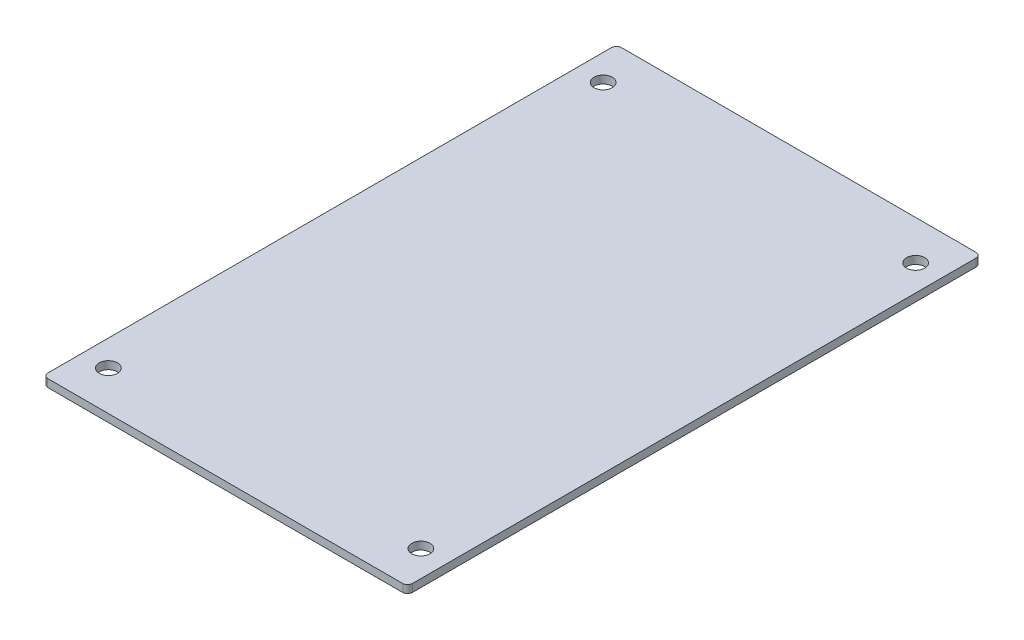
ISO-10303-21;
HEADER;
FILE_DESCRIPTION(('STEP AP214'),'2;1');
FILE_NAME('part.step','',(''),(''),'','','');
FILE_SCHEMA(('AUTOMOTIVE_DESIGN { 1 0 10303 214 1 1 1 1 }'));
ENDSEC;
DATA;
#1=APPLICATION_CONTEXT('core data for automotive mechanical design processes');
#2=APPLICATION_PROTOCOL_DEFINITION('international standard','automotive_design',2000,#1);
#3=PRODUCT_CONTEXT('',#1,'mechanical');
#4=PRODUCT('Part','Part','',(#3));
#5=PRODUCT_RELATED_PRODUCT_CATEGORY('part','',(#4));
#6=PRODUCT_DEFINITION_FORMATION('','',#4);
#7=PRODUCT_DEFINITION_CONTEXT('part definition',#1,'design');
#8=PRODUCT_DEFINITION('design','',#6,#7);
#9=PRODUCT_DEFINITION_SHAPE('','',#8);
#10=(LENGTH_UNIT() NAMED_UNIT(*) SI_UNIT(.MILLI.,.METRE.));
#11=(NAMED_UNIT(*) PLANE_ANGLE_UNIT() SI_UNIT($,.RADIAN.));
#12=(NAMED_UNIT(*) SI_UNIT($,.STERADIAN.) SOLID_ANGLE_UNIT());
#13=UNCERTAINTY_MEASURE_WITH_UNIT(LENGTH_MEASURE(1.E-05),#10,'distance_accuracy_value','');
#14=(GEOMETRIC_REPRESENTATION_CONTEXT(3) GLOBAL_UNCERTAINTY_ASSIGNED_CONTEXT((#13)) GLOBAL_UNIT_ASSIGNED_CONTEXT((#10,
#11,#12)) REPRESENTATION_CONTEXT('',''));
#15=CARTESIAN_POINT('',(0.,0.,0.));
#16=DIRECTION('',(0.,0.,1.));
#17=DIRECTION('',(1.,0.,0.));
#18=AXIS2_PLACEMENT_3D('',#15,#16,#17);
#19=CARTESIAN_POINT('',(0.,1.5,0.));
#20=DIRECTION('',(0.,1.,0.));
#21=DIRECTION('',(0.,0.,1.));
#22=AXIS2_PLACEMENT_3D('',#19,#20,#21);
#23=PLANE('',#22);
#24=CARTESIAN_POINT('',(30.,1.5,47.5));
#25=DIRECTION('',(0.,1.,0.));
#26=DIRECTION('',(0.,0.,1.));
#27=AXIS2_PLACEMENT_3D('',#24,#25,#26);
#28=CIRCLE('',#27,1.75000000000001);
#29=CARTESIAN_POINT('',(30.,1.5,49.25));
#30=VERTEX_POINT('',#29);
#31=EDGE_CURVE('E212',#30,#30,#28,.T.);
#32=ORIENTED_EDGE('',*,*,#31,.F.);
#33=EDGE_LOOP('',(#32));
#34=FACE_BOUND('',#33,.T.);
#35=CARTESIAN_POINT('',(-30.,1.5,-47.5));
#36=DIRECTION('',(0.,1.,0.));
#37=DIRECTION('',(0.,0.,1.));
#38=AXIS2_PLACEMENT_3D('',#35,#36,#37);
#39=CIRCLE('',#38,1.75);
#40=CARTESIAN_POINT('',(-30.,1.5,-45.75));
#41=VERTEX_POINT('',#40);
#42=EDGE_CURVE('E159',#41,#41,#39,.T.);
#43=ORIENTED_EDGE('',*,*,#42,.F.);
#44=EDGE_LOOP('',(#43));
#45=FACE_BOUND('',#44,.T.);
#46=CARTESIAN_POINT('',(30.,1.5,-47.5));
#47=DIRECTION('',(0.,1.,0.));
#48=DIRECTION('',(0.,0.,1.));
#49=AXIS2_PLACEMENT_3D('',#46,#47,#48);
#50=CIRCLE('',#49,1.75000000000001);
#51=CARTESIAN_POINT('',(30.,1.5,-45.75));
#52=VERTEX_POINT('',#51);
#53=EDGE_CURVE('E220',#52,#52,#50,.T.);
#54=ORIENTED_EDGE('',*,*,#53,.F.);
#55=EDGE_LOOP('',(#54));
#56=FACE_BOUND('',#55,.T.);
#57=CARTESIAN_POINT('',(-30.,1.5,47.5));
#58=DIRECTION('',(0.,1.,0.));
#59=DIRECTION('',(0.,0.,1.));
#60=AXIS2_PLACEMENT_3D('',#57,#58,#59);
#61=CIRCLE('',#60,1.75);
#62=CARTESIAN_POINT('',(-30.,1.5,49.25));
#63=VERTEX_POINT('',#62);
#64=EDGE_CURVE('E203',#63,#63,#61,.T.);
#65=ORIENTED_EDGE('',*,*,#64,.F.);
#66=EDGE_LOOP('',(#65));
#67=FACE_BOUND('',#66,.T.);
#68=CARTESIAN_POINT('',(-34.,1.5,54.0627460668062));
#69=DIRECTION('',(0.,1.,0.));
#70=DIRECTION('',(0.,0.,1.));
#71=AXIS2_PLACEMENT_3D('',#68,#69,#70);
#72=CIRCLE('',#71,1.);
#73=CARTESIAN_POINT('',(-35.,1.5,54.0627460668062));
#74=VERTEX_POINT('',#73);
#75=CARTESIAN_POINT('',(-34.125,1.5,55.0549028084555));
#76=VERTEX_POINT('',#75);
#77=EDGE_CURVE('E118',#74,#76,#72,.T.);
#78=ORIENTED_EDGE('',*,*,#77,.T.);
#79=DIRECTION('',(1.,0.,0.));
#80=VECTOR('',#79,1.);
#81=CARTESIAN_POINT('',(34.125,1.5,55.0549028084555));
#82=LINE('',#81,#80);
#83=CARTESIAN_POINT('',(34.125,1.5,55.0549028084555));
#84=VERTEX_POINT('',#83);
#85=EDGE_CURVE('E54',#76,#84,#82,.T.);
#86=ORIENTED_EDGE('',*,*,#85,.T.);
#87=CARTESIAN_POINT('',(34.,1.5,54.0627460668062));
#88=DIRECTION('',(0.,1.,0.));
#89=DIRECTION('',(0.,0.,1.));
#90=AXIS2_PLACEMENT_3D('',#87,#88,#89);
#91=CIRCLE('',#90,1.);
#92=CARTESIAN_POINT('',(35.,1.5,54.0627460668062));
#93=VERTEX_POINT('',#92);
#94=EDGE_CURVE('E115',#84,#93,#91,.T.);
#95=ORIENTED_EDGE('',*,*,#94,.T.);
#96=DIRECTION('',(0.,0.,-1.));
#97=VECTOR('',#96,1.);
#98=CARTESIAN_POINT('',(35.,1.5,55.));
#99=LINE('',#98,#97);
#100=CARTESIAN_POINT('',(35.,1.5,-54.0627460668062));
#101=VERTEX_POINT('',#100);
#102=EDGE_CURVE('E169',#93,#101,#99,.T.);
#103=ORIENTED_EDGE('',*,*,#102,.T.);
#104=CARTESIAN_POINT('',(34.,1.5,-54.0627460668062));
#105=DIRECTION('',(0.,1.,0.));
#106=DIRECTION('',(0.,0.,1.));
#107=AXIS2_PLACEMENT_3D('',#104,#105,#106);
#108=CIRCLE('',#107,1.);
#109=CARTESIAN_POINT('',(34.125,1.5,-55.0549028084555));
#110=VERTEX_POINT('',#109);
#111=EDGE_CURVE('E111',#101,#110,#108,.T.);
#112=ORIENTED_EDGE('',*,*,#111,.T.);
#113=DIRECTION('',(1.,0.,0.));
#114=VECTOR('',#113,1.);
#115=CARTESIAN_POINT('',(34.125,1.5,-55.0549028084555));
#116=LINE('',#115,#114);
#117=CARTESIAN_POINT('',(-34.1249999999999,1.5,-55.0549028084555));
#118=VERTEX_POINT('',#117);
#119=EDGE_CURVE('E191',#118,#110,#116,.T.);
#120=ORIENTED_EDGE('',*,*,#119,.F.);
#121=CARTESIAN_POINT('',(-34.,1.5,-54.0627460668062));
#122=DIRECTION('',(0.,1.,0.));
#123=DIRECTION('',(0.,0.,1.));
#124=AXIS2_PLACEMENT_3D('',#121,#122,#123);
#125=CIRCLE('',#124,1.);
#126=CARTESIAN_POINT('',(-35.,1.5,-54.0627460668062));
#127=VERTEX_POINT('',#126);
#128=EDGE_CURVE('E132',#118,#127,#125,.T.);
#129=ORIENTED_EDGE('',*,*,#128,.T.);
#130=DIRECTION('',(0.,0.,1.));
#131=VECTOR('',#130,1.);
#132=CARTESIAN_POINT('',(-35.,1.5,55.));
#133=LINE('',#132,#131);
#134=EDGE_CURVE('E146',#127,#74,#133,.T.);
#135=ORIENTED_EDGE('',*,*,#134,.T.);
#136=EDGE_LOOP('',(#78,#86,#95,#103,#112,#120,#129,#135));
#137=FACE_BOUND('',#136,.T.);
#138=ADVANCED_FACE('F38',(#34,#45,#56,#67,#137),#23,.T.);
#139=CARTESIAN_POINT('',(0.,0.,0.));
#140=DIRECTION('',(0.,1.,0.));
#141=DIRECTION('',(0.,0.,1.));
#142=AXIS2_PLACEMENT_3D('',#139,#140,#141);
#143=PLANE('',#142);
#144=CARTESIAN_POINT('',(-30.,0.,47.5));
#145=DIRECTION('',(0.,1.,0.));
#146=DIRECTION('',(0.,0.,1.));
#147=AXIS2_PLACEMENT_3D('',#144,#145,#146);
#148=CIRCLE('',#147,1.75);
#149=CARTESIAN_POINT('',(-30.,0.,49.25));
#150=VERTEX_POINT('',#149);
#151=EDGE_CURVE('E198',#150,#150,#148,.T.);
#152=ORIENTED_EDGE('',*,*,#151,.T.);
#153=EDGE_LOOP('',(#152));
#154=FACE_BOUND('',#153,.T.);
#155=CARTESIAN_POINT('',(30.,0.,47.5));
#156=DIRECTION('',(0.,1.,0.));
#157=DIRECTION('',(0.,0.,1.));
#158=AXIS2_PLACEMENT_3D('',#155,#156,#157);
#159=CIRCLE('',#158,1.75000000000001);
#160=CARTESIAN_POINT('',(30.,0.,49.25));
#161=VERTEX_POINT('',#160);
#162=EDGE_CURVE('E210',#161,#161,#159,.T.);
#163=ORIENTED_EDGE('',*,*,#162,.T.);
#164=EDGE_LOOP('',(#163));
#165=FACE_BOUND('',#164,.T.);
#166=CARTESIAN_POINT('',(30.,0.,-47.5));
#167=DIRECTION('',(0.,1.,0.));
#168=DIRECTION('',(0.,0.,1.));
#169=AXIS2_PLACEMENT_3D('',#166,#167,#168);
#170=CIRCLE('',#169,1.75000000000001);
#171=CARTESIAN_POINT('',(30.,0.,-45.75));
#172=VERTEX_POINT('',#171);
#173=EDGE_CURVE('E216',#172,#172,#170,.T.);
#174=ORIENTED_EDGE('',*,*,#173,.T.);
#175=EDGE_LOOP('',(#174));
#176=FACE_BOUND('',#175,.T.);
#177=CARTESIAN_POINT('',(-30.,0.,-47.5));
#178=DIRECTION('',(0.,1.,0.));
#179=DIRECTION('',(0.,0.,1.));
#180=AXIS2_PLACEMENT_3D('',#177,#178,#179);
#181=CIRCLE('',#180,1.75);
#182=CARTESIAN_POINT('',(-30.,0.,-45.75));
#183=VERTEX_POINT('',#182);
#184=EDGE_CURVE('E166',#183,#183,#181,.T.);
#185=ORIENTED_EDGE('',*,*,#184,.T.);
#186=EDGE_LOOP('',(#185));
#187=FACE_BOUND('',#186,.T.);
#188=DIRECTION('',(1.,0.,0.));
#189=VECTOR('',#188,1.);
#190=CARTESIAN_POINT('',(0.,0.,55.0549028084555));
#191=LINE('',#190,#189);
#192=CARTESIAN_POINT('',(-34.1249999999999,0.,55.0549028084555));
#193=VERTEX_POINT('',#192);
#194=CARTESIAN_POINT('',(34.125,0.,55.0549028084555));
#195=VERTEX_POINT('',#194);
#196=EDGE_CURVE('E105',#193,#195,#191,.T.);
#197=ORIENTED_EDGE('',*,*,#196,.F.);
#198=CARTESIAN_POINT('',(-34.,0.,54.0627460668062));
#199=DIRECTION('',(0.,1.,0.));
#200=DIRECTION('',(0.,0.,1.));
#201=AXIS2_PLACEMENT_3D('',#198,#199,#200);
#202=CIRCLE('',#201,1.);
#203=CARTESIAN_POINT('',(-35.,0.,54.0627460668062));
#204=VERTEX_POINT('',#203);
#205=EDGE_CURVE('E156',#193,#204,#202,.F.);
#206=ORIENTED_EDGE('',*,*,#205,.T.);
#207=DIRECTION('',(0.,0.,1.));
#208=VECTOR('',#207,1.);
#209=CARTESIAN_POINT('',(-35.,0.,55.));
#210=LINE('',#209,#208);
#211=CARTESIAN_POINT('',(-35.,0.,-54.0627460668062));
#212=VERTEX_POINT('',#211);
#213=EDGE_CURVE('E145',#212,#204,#210,.T.);
#214=ORIENTED_EDGE('',*,*,#213,.F.);
#215=CARTESIAN_POINT('',(-34.,0.,-54.0627460668062));
#216=DIRECTION('',(0.,1.,0.));
#217=DIRECTION('',(0.,0.,1.));
#218=AXIS2_PLACEMENT_3D('',#215,#216,#217);
#219=CIRCLE('',#218,1.);
#220=CARTESIAN_POINT('',(-34.125,0.,-55.0549028084554));
#221=VERTEX_POINT('',#220);
#222=EDGE_CURVE('E153',#212,#221,#219,.F.);
#223=ORIENTED_EDGE('',*,*,#222,.T.);
#224=DIRECTION('',(1.,0.,0.));
#225=VECTOR('',#224,1.);
#226=CARTESIAN_POINT('',(0.,0.,-55.0549028084555));
#227=LINE('',#226,#225);
#228=CARTESIAN_POINT('',(34.125,0.,-55.0549028084555));
#229=VERTEX_POINT('',#228);
#230=EDGE_CURVE('E194',#221,#229,#227,.T.);
#231=ORIENTED_EDGE('',*,*,#230,.T.);
#232=CARTESIAN_POINT('',(34.,0.,-54.0627460668062));
#233=DIRECTION('',(0.,1.,0.));
#234=DIRECTION('',(0.,0.,1.));
#235=AXIS2_PLACEMENT_3D('',#232,#233,#234);
#236=CIRCLE('',#235,1.);
#237=CARTESIAN_POINT('',(35.,0.,-54.0627460668062));
#238=VERTEX_POINT('',#237);
#239=EDGE_CURVE('E182',#229,#238,#236,.F.);
#240=ORIENTED_EDGE('',*,*,#239,.T.);
#241=DIRECTION('',(0.,0.,-1.));
#242=VECTOR('',#241,1.);
#243=CARTESIAN_POINT('',(35.,0.,55.));
#244=LINE('',#243,#242);
#245=CARTESIAN_POINT('',(35.,0.,54.0627460668062));
#246=VERTEX_POINT('',#245);
#247=EDGE_CURVE('E158',#246,#238,#244,.T.);
#248=ORIENTED_EDGE('',*,*,#247,.F.);
#249=CARTESIAN_POINT('',(34.,0.,54.0627460668062));
#250=DIRECTION('',(0.,1.,0.));
#251=DIRECTION('',(0.,0.,1.));
#252=AXIS2_PLACEMENT_3D('',#249,#250,#251);
#253=CIRCLE('',#252,1.);
#254=EDGE_CURVE('E179',#246,#195,#253,.F.);
#255=ORIENTED_EDGE('',*,*,#254,.T.);
#256=EDGE_LOOP('',(#197,#206,#214,#223,#231,#240,#248,#255));
#257=FACE_BOUND('',#256,.T.);
#258=ADVANCED_FACE('F151',(#154,#165,#176,#187,#257),#143,.F.);
#259=CARTESIAN_POINT('',(-35.,1.5,55.));
#260=DIRECTION('',(1.,0.,0.));
#261=DIRECTION('',(0.,0.,-1.));
#262=AXIS2_PLACEMENT_3D('',#259,#260,#261);
#263=PLANE('',#262);
#264=ORIENTED_EDGE('',*,*,#213,.T.);
#265=DIRECTION('',(0.,1.,0.));
#266=VECTOR('',#265,1.);
#267=CARTESIAN_POINT('',(-35.,1.5,54.0627460668062));
#268=LINE('',#267,#266);
#269=EDGE_CURVE('E47',#204,#74,#268,.T.);
#270=ORIENTED_EDGE('',*,*,#269,.T.);
#271=ORIENTED_EDGE('',*,*,#134,.F.);
#272=DIRECTION('',(0.,1.,0.));
#273=VECTOR('',#272,1.);
#274=CARTESIAN_POINT('',(-35.,1.5,-54.0627460668062));
#275=LINE('',#274,#273);
#276=EDGE_CURVE('E138',#127,#212,#275,.F.);
#277=ORIENTED_EDGE('',*,*,#276,.T.);
#278=EDGE_LOOP('',(#264,#270,#271,#277));
#279=FACE_BOUND('',#278,.T.);
#280=ADVANCED_FACE('F144',(#279),#263,.F.);
#281=CARTESIAN_POINT('',(35.,1.5,55.));
#282=DIRECTION('',(-1.,0.,0.));
#283=DIRECTION('',(0.,0.,1.));
#284=AXIS2_PLACEMENT_3D('',#281,#282,#283);
#285=PLANE('',#284);
#286=ORIENTED_EDGE('',*,*,#247,.T.);
#287=DIRECTION('',(0.,1.,0.));
#288=VECTOR('',#287,1.);
#289=CARTESIAN_POINT('',(35.,1.5,-54.0627460668062));
#290=LINE('',#289,#288);
#291=EDGE_CURVE('E187',#238,#101,#290,.T.);
#292=ORIENTED_EDGE('',*,*,#291,.T.);
#293=ORIENTED_EDGE('',*,*,#102,.F.);
#294=DIRECTION('',(0.,1.,0.));
#295=VECTOR('',#294,1.);
#296=CARTESIAN_POINT('',(35.,1.5,54.0627460668062));
#297=LINE('',#296,#295);
#298=EDGE_CURVE('E125',#93,#246,#297,.F.);
#299=ORIENTED_EDGE('',*,*,#298,.T.);
#300=EDGE_LOOP('',(#286,#292,#293,#299));
#301=FACE_BOUND('',#300,.T.);
#302=ADVANCED_FACE('F237',(#301),#285,.F.);
#303=CARTESIAN_POINT('',(-30.,1.5,-47.5));
#304=DIRECTION('',(0.,-1.,0.));
#305=DIRECTION('',(0.,0.,-1.));
#306=AXIS2_PLACEMENT_3D('',#303,#304,#305);
#307=CYLINDRICAL_SURFACE('',#306,1.75);
#308=ORIENTED_EDGE('',*,*,#42,.T.);
#309=EDGE_LOOP('',(#308));
#310=FACE_BOUND('',#309,.T.);
#311=ORIENTED_EDGE('',*,*,#184,.F.);
#312=EDGE_LOOP('',(#311));
#313=FACE_BOUND('',#312,.T.);
#314=ADVANCED_FACE('F239',(#310,#313),#307,.F.);
#315=CARTESIAN_POINT('',(30.,1.5,-47.5));
#316=DIRECTION('',(0.,-1.,0.));
#317=DIRECTION('',(0.,0.,-1.));
#318=AXIS2_PLACEMENT_3D('',#315,#316,#317);
#319=CYLINDRICAL_SURFACE('',#318,1.75000000000001);
#320=ORIENTED_EDGE('',*,*,#53,.T.);
#321=EDGE_LOOP('',(#320));
#322=FACE_BOUND('',#321,.T.);
#323=ORIENTED_EDGE('',*,*,#173,.F.);
#324=EDGE_LOOP('',(#323));
#325=FACE_BOUND('',#324,.T.);
#326=ADVANCED_FACE('F245',(#322,#325),#319,.F.);
#327=CARTESIAN_POINT('',(30.,1.5,47.5));
#328=DIRECTION('',(0.,-1.,0.));
#329=DIRECTION('',(0.,0.,-1.));
#330=AXIS2_PLACEMENT_3D('',#327,#328,#329);
#331=CYLINDRICAL_SURFACE('',#330,1.75000000000001);
#332=ORIENTED_EDGE('',*,*,#31,.T.);
#333=EDGE_LOOP('',(#332));
#334=FACE_BOUND('',#333,.T.);
#335=ORIENTED_EDGE('',*,*,#162,.F.);
#336=EDGE_LOOP('',(#335));
#337=FACE_BOUND('',#336,.T.);
#338=ADVANCED_FACE('F263',(#334,#337),#331,.F.);
#339=CARTESIAN_POINT('',(-30.,1.5,47.5));
#340=DIRECTION('',(0.,-1.,0.));
#341=DIRECTION('',(0.,0.,-1.));
#342=AXIS2_PLACEMENT_3D('',#339,#340,#341);
#343=CYLINDRICAL_SURFACE('',#342,1.75);
#344=ORIENTED_EDGE('',*,*,#64,.T.);
#345=EDGE_LOOP('',(#344));
#346=FACE_BOUND('',#345,.T.);
#347=ORIENTED_EDGE('',*,*,#151,.F.);
#348=EDGE_LOOP('',(#347));
#349=FACE_BOUND('',#348,.T.);
#350=ADVANCED_FACE('F267',(#346,#349),#343,.F.);
#351=CARTESIAN_POINT('',(34.,1.5,-54.0627460668062));
#352=DIRECTION('',(0.,1.,0.));
#353=DIRECTION('',(0.,0.,1.));
#354=AXIS2_PLACEMENT_3D('',#351,#352,#353);
#355=CYLINDRICAL_SURFACE('',#354,1.);
#356=ORIENTED_EDGE('',*,*,#111,.F.);
#357=ORIENTED_EDGE('',*,*,#291,.F.);
#358=ORIENTED_EDGE('',*,*,#239,.F.);
#359=DIRECTION('',(0.,1.,0.));
#360=VECTOR('',#359,1.);
#361=CARTESIAN_POINT('',(34.125,1.5,-55.0549028084555));
#362=LINE('',#361,#360);
#363=EDGE_CURVE('E172',#110,#229,#362,.F.);
#364=ORIENTED_EDGE('',*,*,#363,.F.);
#365=EDGE_LOOP('',(#356,#357,#358,#364));
#366=FACE_BOUND('',#365,.T.);
#367=ADVANCED_FACE('F235',(#366),#355,.T.);
#368=CARTESIAN_POINT('',(34.,1.5,54.0627460668062));
#369=DIRECTION('',(0.,1.,0.));
#370=DIRECTION('',(0.,0.,1.));
#371=AXIS2_PLACEMENT_3D('',#368,#369,#370);
#372=CYLINDRICAL_SURFACE('',#371,1.);
#373=ORIENTED_EDGE('',*,*,#94,.F.);
#374=DIRECTION('',(0.,1.,0.));
#375=VECTOR('',#374,1.);
#376=CARTESIAN_POINT('',(34.125,1.5,55.0549028084555));
#377=LINE('',#376,#375);
#378=EDGE_CURVE('E102',#195,#84,#377,.T.);
#379=ORIENTED_EDGE('',*,*,#378,.F.);
#380=ORIENTED_EDGE('',*,*,#254,.F.);
#381=ORIENTED_EDGE('',*,*,#298,.F.);
#382=EDGE_LOOP('',(#373,#379,#380,#381));
#383=FACE_BOUND('',#382,.T.);
#384=ADVANCED_FACE('F123',(#383),#372,.T.);
#385=CARTESIAN_POINT('',(-34.,1.5,54.0627460668062));
#386=DIRECTION('',(0.,1.,0.));
#387=DIRECTION('',(0.,0.,1.));
#388=AXIS2_PLACEMENT_3D('',#385,#386,#387);
#389=CYLINDRICAL_SURFACE('',#388,1.);
#390=ORIENTED_EDGE('',*,*,#77,.F.);
#391=ORIENTED_EDGE('',*,*,#269,.F.);
#392=ORIENTED_EDGE('',*,*,#205,.F.);
#393=DIRECTION('',(0.,1.,0.));
#394=VECTOR('',#393,1.);
#395=CARTESIAN_POINT('',(-34.125,1.5,55.0549028084555));
#396=LINE('',#395,#394);
#397=EDGE_CURVE('E110',#76,#193,#396,.F.);
#398=ORIENTED_EDGE('',*,*,#397,.F.);
#399=EDGE_LOOP('',(#390,#391,#392,#398));
#400=FACE_BOUND('',#399,.T.);
#401=ADVANCED_FACE('F297',(#400),#389,.T.);
#402=CARTESIAN_POINT('',(-34.,1.5,-54.0627460668062));
#403=DIRECTION('',(0.,1.,0.));
#404=DIRECTION('',(0.,0.,1.));
#405=AXIS2_PLACEMENT_3D('',#402,#403,#404);
#406=CYLINDRICAL_SURFACE('',#405,1.);
#407=ORIENTED_EDGE('',*,*,#128,.F.);
#408=DIRECTION('',(0.,1.,0.));
#409=VECTOR('',#408,1.);
#410=CARTESIAN_POINT('',(-34.125,1.5,-55.0549028084554));
#411=LINE('',#410,#409);
#412=EDGE_CURVE('E11',#221,#118,#411,.T.);
#413=ORIENTED_EDGE('',*,*,#412,.F.);
#414=ORIENTED_EDGE('',*,*,#222,.F.);
#415=ORIENTED_EDGE('',*,*,#276,.F.);
#416=EDGE_LOOP('',(#407,#413,#414,#415));
#417=FACE_BOUND('',#416,.T.);
#418=ADVANCED_FACE('F40',(#417),#406,.T.);
#419=CARTESIAN_POINT('',(34.125,-8.5,-55.0549028084555));
#420=DIRECTION('',(0.,0.,1.));
#421=DIRECTION('',(1.,0.,0.));
#422=AXIS2_PLACEMENT_3D('',#419,#420,#421);
#423=PLANE('',#422);
#424=ORIENTED_EDGE('',*,*,#412,.T.);
#425=ORIENTED_EDGE('',*,*,#119,.T.);
#426=ORIENTED_EDGE('',*,*,#363,.T.);
#427=ORIENTED_EDGE('',*,*,#230,.F.);
#428=EDGE_LOOP('',(#424,#425,#426,#427));
#429=FACE_BOUND('',#428,.T.);
#430=ADVANCED_FACE('F193',(#429),#423,.F.);
#431=CARTESIAN_POINT('',(34.125,-8.5,55.0549028084555));
#432=DIRECTION('',(0.,0.,1.));
#433=DIRECTION('',(1.,0.,0.));
#434=AXIS2_PLACEMENT_3D('',#431,#432,#433);
#435=PLANE('',#434);
#436=ORIENTED_EDGE('',*,*,#196,.T.);
#437=ORIENTED_EDGE('',*,*,#378,.T.);
#438=ORIENTED_EDGE('',*,*,#85,.F.);
#439=ORIENTED_EDGE('',*,*,#397,.T.);
#440=EDGE_LOOP('',(#436,#437,#438,#439));
#441=FACE_BOUND('',#440,.T.);
#442=ADVANCED_FACE('F103',(#441),#435,.T.);
#443=CLOSED_SHELL('',(#138,#258,#280,#302,#314,#326,#338,#350,#367,#384,#401,#418,#430,#442));
#444=MANIFOLD_SOLID_BREP('B2',#443);
#445=ADVANCED_BREP_SHAPE_REPRESENTATION('',(#18,#444),#14);
#446=SHAPE_DEFINITION_REPRESENTATION(#9,#445);
ENDSEC;
END-ISO-10303-21;
